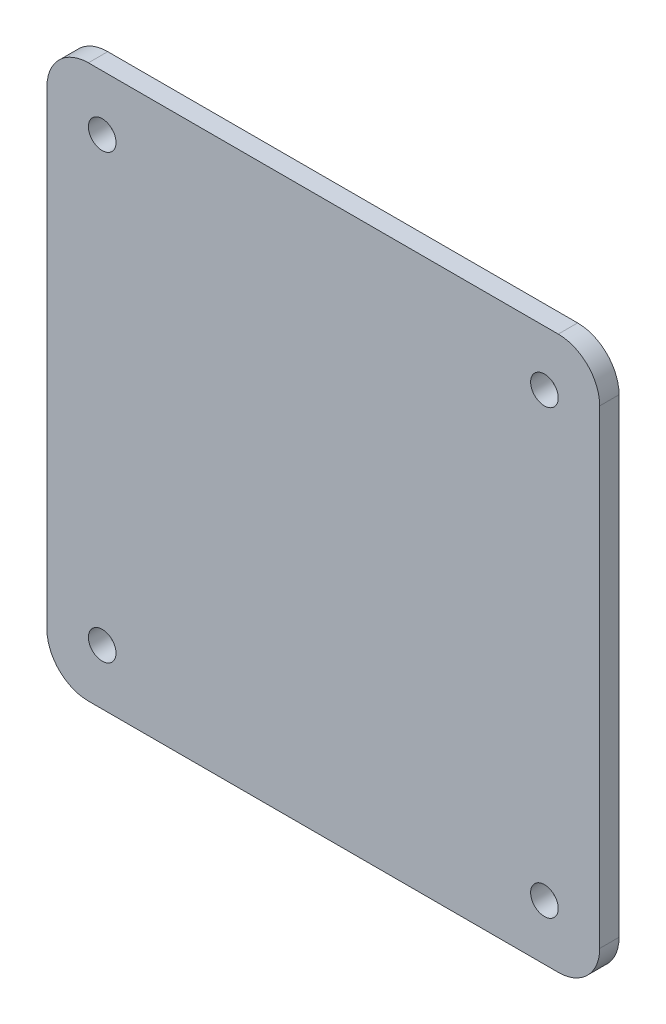
ISO-10303-21;
HEADER;
FILE_DESCRIPTION(('STEP AP214'),'2;1');
FILE_NAME('part.step','',(''),(''),'','','');
FILE_SCHEMA(('AUTOMOTIVE_DESIGN { 1 0 10303 214 1 1 1 1 }'));
ENDSEC;
DATA;
#1=APPLICATION_CONTEXT('core data for automotive mechanical design processes');
#2=APPLICATION_PROTOCOL_DEFINITION('international standard','automotive_design',2000,#1);
#3=PRODUCT_CONTEXT('',#1,'mechanical');
#4=PRODUCT('Part','Part','',(#3));
#5=PRODUCT_RELATED_PRODUCT_CATEGORY('part','',(#4));
#6=PRODUCT_DEFINITION_FORMATION('','',#4);
#7=PRODUCT_DEFINITION_CONTEXT('part definition',#1,'design');
#8=PRODUCT_DEFINITION('design','',#6,#7);
#9=PRODUCT_DEFINITION_SHAPE('','',#8);
#10=(LENGTH_UNIT() NAMED_UNIT(*) SI_UNIT(.MILLI.,.METRE.));
#11=(NAMED_UNIT(*) PLANE_ANGLE_UNIT() SI_UNIT($,.RADIAN.));
#12=(NAMED_UNIT(*) SI_UNIT($,.STERADIAN.) SOLID_ANGLE_UNIT());
#13=UNCERTAINTY_MEASURE_WITH_UNIT(LENGTH_MEASURE(1.E-05),#10,'distance_accuracy_value','');
#14=(GEOMETRIC_REPRESENTATION_CONTEXT(3) GLOBAL_UNCERTAINTY_ASSIGNED_CONTEXT((#13)) GLOBAL_UNIT_ASSIGNED_CONTEXT((#10,
#11,#12)) REPRESENTATION_CONTEXT('',''));
#15=CARTESIAN_POINT('',(0.,0.,0.));
#16=DIRECTION('',(0.,0.,1.));
#17=DIRECTION('',(1.,0.,0.));
#18=AXIS2_PLACEMENT_3D('',#15,#16,#17);
#19=CARTESIAN_POINT('',(0.,0.,7.));
#20=DIRECTION('',(0.,0.,-1.));
#21=DIRECTION('',(-1.,0.,0.));
#22=AXIS2_PLACEMENT_3D('',#19,#20,#21);
#23=PLANE('',#22);
#24=DIRECTION('',(0.,-1.,0.));
#25=VECTOR('',#24,1.);
#26=CARTESIAN_POINT('',(-100.,-100.,7.));
#27=LINE('',#26,#25);
#28=CARTESIAN_POINT('',(-100.,85.,7.));
#29=VERTEX_POINT('',#28);
#30=CARTESIAN_POINT('',(-100.,-85.,7.));
#31=VERTEX_POINT('',#30);
#32=EDGE_CURVE('E140',#29,#31,#27,.T.);
#33=ORIENTED_EDGE('',*,*,#32,.T.);
#34=CARTESIAN_POINT('',(-85.,-85.,7.));
#35=DIRECTION('',(0.,0.,-1.));
#36=DIRECTION('',(-1.,0.,0.));
#37=AXIS2_PLACEMENT_3D('',#34,#35,#36);
#38=CIRCLE('',#37,15.);
#39=CARTESIAN_POINT('',(-85.,-100.,7.));
#40=VERTEX_POINT('',#39);
#41=EDGE_CURVE('E155',#31,#40,#38,.F.);
#42=ORIENTED_EDGE('',*,*,#41,.T.);
#43=DIRECTION('',(1.,0.,0.));
#44=VECTOR('',#43,1.);
#45=CARTESIAN_POINT('',(-100.,-100.,7.));
#46=LINE('',#45,#44);
#47=CARTESIAN_POINT('',(85.,-100.,7.));
#48=VERTEX_POINT('',#47);
#49=EDGE_CURVE('E122',#40,#48,#46,.T.);
#50=ORIENTED_EDGE('',*,*,#49,.T.);
#51=CARTESIAN_POINT('',(85.,-85.,7.));
#52=DIRECTION('',(0.,0.,-1.));
#53=DIRECTION('',(-1.,0.,0.));
#54=AXIS2_PLACEMENT_3D('',#51,#52,#53);
#55=CIRCLE('',#54,15.);
#56=CARTESIAN_POINT('',(100.,-85.,7.));
#57=VERTEX_POINT('',#56);
#58=EDGE_CURVE('E150',#48,#57,#55,.F.);
#59=ORIENTED_EDGE('',*,*,#58,.T.);
#60=DIRECTION('',(0.,1.,0.));
#61=VECTOR('',#60,1.);
#62=CARTESIAN_POINT('',(100.,-100.,7.));
#63=LINE('',#62,#61);
#64=CARTESIAN_POINT('',(100.,85.,7.));
#65=VERTEX_POINT('',#64);
#66=EDGE_CURVE('E166',#57,#65,#63,.T.);
#67=ORIENTED_EDGE('',*,*,#66,.T.);
#68=CARTESIAN_POINT('',(85.,85.,7.));
#69=DIRECTION('',(0.,0.,-1.));
#70=DIRECTION('',(-1.,0.,0.));
#71=AXIS2_PLACEMENT_3D('',#68,#69,#70);
#72=CIRCLE('',#71,15.);
#73=CARTESIAN_POINT('',(85.,100.,7.));
#74=VERTEX_POINT('',#73);
#75=EDGE_CURVE('E58',#65,#74,#72,.F.);
#76=ORIENTED_EDGE('',*,*,#75,.T.);
#77=DIRECTION('',(-1.,0.,0.));
#78=VECTOR('',#77,1.);
#79=CARTESIAN_POINT('',(-100.,100.,7.));
#80=LINE('',#79,#78);
#81=CARTESIAN_POINT('',(-85.,100.,7.));
#82=VERTEX_POINT('',#81);
#83=EDGE_CURVE('E141',#74,#82,#80,.T.);
#84=ORIENTED_EDGE('',*,*,#83,.T.);
#85=CARTESIAN_POINT('',(-85.,85.,7.));
#86=DIRECTION('',(0.,0.,-1.));
#87=DIRECTION('',(-1.,0.,0.));
#88=AXIS2_PLACEMENT_3D('',#85,#86,#87);
#89=CIRCLE('',#88,15.);
#90=EDGE_CURVE('E153',#82,#29,#89,.F.);
#91=ORIENTED_EDGE('',*,*,#90,.T.);
#92=EDGE_LOOP('',(#33,#42,#50,#59,#67,#76,#84,#91));
#93=FACE_BOUND('',#92,.T.);
#94=CARTESIAN_POINT('',(80.,80.,7.));
#95=DIRECTION('',(0.,0.,1.));
#96=DIRECTION('',(1.,0.,0.));
#97=AXIS2_PLACEMENT_3D('',#94,#95,#96);
#98=CIRCLE('',#97,5.00000000000001);
#99=CARTESIAN_POINT('',(85.,80.,7.));
#100=VERTEX_POINT('',#99);
#101=EDGE_CURVE('E135',#100,#100,#98,.T.);
#102=ORIENTED_EDGE('',*,*,#101,.F.);
#103=EDGE_LOOP('',(#102));
#104=FACE_BOUND('',#103,.T.);
#105=CARTESIAN_POINT('',(80.,-80.,7.));
#106=DIRECTION('',(0.,0.,1.));
#107=DIRECTION('',(1.,0.,0.));
#108=AXIS2_PLACEMENT_3D('',#105,#106,#107);
#109=CIRCLE('',#108,5.00000000000001);
#110=CARTESIAN_POINT('',(85.,-80.,7.));
#111=VERTEX_POINT('',#110);
#112=EDGE_CURVE('E183',#111,#111,#109,.T.);
#113=ORIENTED_EDGE('',*,*,#112,.F.);
#114=EDGE_LOOP('',(#113));
#115=FACE_BOUND('',#114,.T.);
#116=CARTESIAN_POINT('',(-80.,-80.,7.));
#117=DIRECTION('',(0.,0.,1.));
#118=DIRECTION('',(1.,0.,0.));
#119=AXIS2_PLACEMENT_3D('',#116,#117,#118);
#120=CIRCLE('',#119,5.00000000000001);
#121=CARTESIAN_POINT('',(-75.,-80.,7.));
#122=VERTEX_POINT('',#121);
#123=EDGE_CURVE('E189',#122,#122,#120,.T.);
#124=ORIENTED_EDGE('',*,*,#123,.F.);
#125=EDGE_LOOP('',(#124));
#126=FACE_BOUND('',#125,.T.);
#127=CARTESIAN_POINT('',(-80.,80.,7.));
#128=DIRECTION('',(0.,0.,1.));
#129=DIRECTION('',(1.,0.,0.));
#130=AXIS2_PLACEMENT_3D('',#127,#128,#129);
#131=CIRCLE('',#130,5.00000000000001);
#132=CARTESIAN_POINT('',(-75.,80.,7.));
#133=VERTEX_POINT('',#132);
#134=EDGE_CURVE('E195',#133,#133,#131,.T.);
#135=ORIENTED_EDGE('',*,*,#134,.F.);
#136=EDGE_LOOP('',(#135));
#137=FACE_BOUND('',#136,.T.);
#138=ADVANCED_FACE('F36',(#93,#104,#115,#126,#137),#23,.F.);
#139=CARTESIAN_POINT('',(0.,0.,0.));
#140=DIRECTION('',(0.,0.,-1.));
#141=DIRECTION('',(-1.,0.,0.));
#142=AXIS2_PLACEMENT_3D('',#139,#140,#141);
#143=PLANE('',#142);
#144=CARTESIAN_POINT('',(-80.,-80.,0.));
#145=DIRECTION('',(0.,0.,1.));
#146=DIRECTION('',(1.,0.,0.));
#147=AXIS2_PLACEMENT_3D('',#144,#145,#146);
#148=CIRCLE('',#147,5.00000000000001);
#149=CARTESIAN_POINT('',(-75.,-80.,0.));
#150=VERTEX_POINT('',#149);
#151=EDGE_CURVE('E192',#150,#150,#148,.T.);
#152=ORIENTED_EDGE('',*,*,#151,.T.);
#153=EDGE_LOOP('',(#152));
#154=FACE_BOUND('',#153,.T.);
#155=CARTESIAN_POINT('',(80.,80.,0.));
#156=DIRECTION('',(0.,0.,1.));
#157=DIRECTION('',(1.,0.,0.));
#158=AXIS2_PLACEMENT_3D('',#155,#156,#157);
#159=CIRCLE('',#158,5.00000000000001);
#160=CARTESIAN_POINT('',(85.,80.,0.));
#161=VERTEX_POINT('',#160);
#162=EDGE_CURVE('E180',#161,#161,#159,.T.);
#163=ORIENTED_EDGE('',*,*,#162,.T.);
#164=EDGE_LOOP('',(#163));
#165=FACE_BOUND('',#164,.T.);
#166=DIRECTION('',(1.,0.,0.));
#167=VECTOR('',#166,1.);
#168=CARTESIAN_POINT('',(-100.,-100.,0.));
#169=LINE('',#168,#167);
#170=CARTESIAN_POINT('',(-85.,-100.,0.));
#171=VERTEX_POINT('',#170);
#172=CARTESIAN_POINT('',(85.,-100.,0.));
#173=VERTEX_POINT('',#172);
#174=EDGE_CURVE('E119',#171,#173,#169,.T.);
#175=ORIENTED_EDGE('',*,*,#174,.F.);
#176=CARTESIAN_POINT('',(-85.,-85.,0.));
#177=DIRECTION('',(0.,0.,-1.));
#178=DIRECTION('',(-1.,0.,0.));
#179=AXIS2_PLACEMENT_3D('',#176,#177,#178);
#180=CIRCLE('',#179,15.);
#181=CARTESIAN_POINT('',(-100.,-85.,0.));
#182=VERTEX_POINT('',#181);
#183=EDGE_CURVE('E102',#171,#182,#180,.T.);
#184=ORIENTED_EDGE('',*,*,#183,.T.);
#185=DIRECTION('',(0.,-1.,0.));
#186=VECTOR('',#185,1.);
#187=CARTESIAN_POINT('',(-100.,-100.,0.));
#188=LINE('',#187,#186);
#189=CARTESIAN_POINT('',(-100.,85.,0.));
#190=VERTEX_POINT('',#189);
#191=EDGE_CURVE('E130',#190,#182,#188,.T.);
#192=ORIENTED_EDGE('',*,*,#191,.F.);
#193=CARTESIAN_POINT('',(-85.,85.,0.));
#194=DIRECTION('',(0.,0.,-1.));
#195=DIRECTION('',(-1.,0.,0.));
#196=AXIS2_PLACEMENT_3D('',#193,#194,#195);
#197=CIRCLE('',#196,15.);
#198=CARTESIAN_POINT('',(-85.,100.,0.));
#199=VERTEX_POINT('',#198);
#200=EDGE_CURVE('E113',#190,#199,#197,.T.);
#201=ORIENTED_EDGE('',*,*,#200,.T.);
#202=DIRECTION('',(-1.,0.,0.));
#203=VECTOR('',#202,1.);
#204=CARTESIAN_POINT('',(-100.,100.,0.));
#205=LINE('',#204,#203);
#206=CARTESIAN_POINT('',(85.,100.,0.));
#207=VERTEX_POINT('',#206);
#208=EDGE_CURVE('E133',#207,#199,#205,.T.);
#209=ORIENTED_EDGE('',*,*,#208,.F.);
#210=CARTESIAN_POINT('',(85.,85.,0.));
#211=DIRECTION('',(0.,0.,-1.));
#212=DIRECTION('',(-1.,0.,0.));
#213=AXIS2_PLACEMENT_3D('',#210,#211,#212);
#214=CIRCLE('',#213,15.);
#215=CARTESIAN_POINT('',(100.,85.,0.));
#216=VERTEX_POINT('',#215);
#217=EDGE_CURVE('E144',#207,#216,#214,.T.);
#218=ORIENTED_EDGE('',*,*,#217,.T.);
#219=DIRECTION('',(0.,1.,0.));
#220=VECTOR('',#219,1.);
#221=CARTESIAN_POINT('',(100.,-100.,0.));
#222=LINE('',#221,#220);
#223=CARTESIAN_POINT('',(100.,-85.,0.));
#224=VERTEX_POINT('',#223);
#225=EDGE_CURVE('E129',#224,#216,#222,.T.);
#226=ORIENTED_EDGE('',*,*,#225,.F.);
#227=CARTESIAN_POINT('',(85.,-85.,0.));
#228=DIRECTION('',(0.,0.,-1.));
#229=DIRECTION('',(-1.,0.,0.));
#230=AXIS2_PLACEMENT_3D('',#227,#228,#229);
#231=CIRCLE('',#230,15.);
#232=EDGE_CURVE('E123',#224,#173,#231,.T.);
#233=ORIENTED_EDGE('',*,*,#232,.T.);
#234=EDGE_LOOP('',(#175,#184,#192,#201,#209,#218,#226,#233));
#235=FACE_BOUND('',#234,.T.);
#236=CARTESIAN_POINT('',(80.,-80.,0.));
#237=DIRECTION('',(0.,0.,1.));
#238=DIRECTION('',(1.,0.,0.));
#239=AXIS2_PLACEMENT_3D('',#236,#237,#238);
#240=CIRCLE('',#239,5.00000000000001);
#241=CARTESIAN_POINT('',(85.,-80.,0.));
#242=VERTEX_POINT('',#241);
#243=EDGE_CURVE('E186',#242,#242,#240,.T.);
#244=ORIENTED_EDGE('',*,*,#243,.T.);
#245=EDGE_LOOP('',(#244));
#246=FACE_BOUND('',#245,.T.);
#247=CARTESIAN_POINT('',(-80.,80.,0.));
#248=DIRECTION('',(0.,0.,1.));
#249=DIRECTION('',(1.,0.,0.));
#250=AXIS2_PLACEMENT_3D('',#247,#248,#249);
#251=CIRCLE('',#250,5.00000000000001);
#252=CARTESIAN_POINT('',(-75.,80.,0.));
#253=VERTEX_POINT('',#252);
#254=EDGE_CURVE('E198',#253,#253,#251,.T.);
#255=ORIENTED_EDGE('',*,*,#254,.T.);
#256=EDGE_LOOP('',(#255));
#257=FACE_BOUND('',#256,.T.);
#258=ADVANCED_FACE('F126',(#154,#165,#235,#246,#257),#143,.T.);
#259=CARTESIAN_POINT('',(-100.,-100.,7.));
#260=DIRECTION('',(1.,0.,0.));
#261=DIRECTION('',(0.,0.,-1.));
#262=AXIS2_PLACEMENT_3D('',#259,#260,#261);
#263=PLANE('',#262);
#264=ORIENTED_EDGE('',*,*,#191,.T.);
#265=DIRECTION('',(0.,0.,-1.));
#266=VECTOR('',#265,1.);
#267=CARTESIAN_POINT('',(-100.,-85.,7.));
#268=LINE('',#267,#266);
#269=EDGE_CURVE('E107',#182,#31,#268,.F.);
#270=ORIENTED_EDGE('',*,*,#269,.T.);
#271=ORIENTED_EDGE('',*,*,#32,.F.);
#272=DIRECTION('',(0.,0.,-1.));
#273=VECTOR('',#272,1.);
#274=CARTESIAN_POINT('',(-100.,85.,7.));
#275=LINE('',#274,#273);
#276=EDGE_CURVE('E112',#29,#190,#275,.T.);
#277=ORIENTED_EDGE('',*,*,#276,.T.);
#278=EDGE_LOOP('',(#264,#270,#271,#277));
#279=FACE_BOUND('',#278,.T.);
#280=ADVANCED_FACE('F212',(#279),#263,.F.);
#281=CARTESIAN_POINT('',(-100.,-100.,7.));
#282=DIRECTION('',(0.,1.,0.));
#283=DIRECTION('',(-1.,0.,0.));
#284=AXIS2_PLACEMENT_3D('',#281,#282,#283);
#285=PLANE('',#284);
#286=ORIENTED_EDGE('',*,*,#49,.F.);
#287=DIRECTION('',(0.,0.,-1.));
#288=VECTOR('',#287,1.);
#289=CARTESIAN_POINT('',(-85.,-100.,7.));
#290=LINE('',#289,#288);
#291=EDGE_CURVE('E106',#40,#171,#290,.T.);
#292=ORIENTED_EDGE('',*,*,#291,.T.);
#293=ORIENTED_EDGE('',*,*,#174,.T.);
#294=DIRECTION('',(0.,0.,-1.));
#295=VECTOR('',#294,1.);
#296=CARTESIAN_POINT('',(85.,-100.,7.));
#297=LINE('',#296,#295);
#298=EDGE_CURVE('E124',#173,#48,#297,.F.);
#299=ORIENTED_EDGE('',*,*,#298,.T.);
#300=EDGE_LOOP('',(#286,#292,#293,#299));
#301=FACE_BOUND('',#300,.T.);
#302=ADVANCED_FACE('F118',(#301),#285,.F.);
#303=CARTESIAN_POINT('',(100.,-100.,7.));
#304=DIRECTION('',(-1.,0.,0.));
#305=DIRECTION('',(0.,0.,1.));
#306=AXIS2_PLACEMENT_3D('',#303,#304,#305);
#307=PLANE('',#306);
#308=ORIENTED_EDGE('',*,*,#225,.T.);
#309=DIRECTION('',(0.,0.,-1.));
#310=VECTOR('',#309,1.);
#311=CARTESIAN_POINT('',(100.,85.,7.));
#312=LINE('',#311,#310);
#313=EDGE_CURVE('E11',#216,#65,#312,.F.);
#314=ORIENTED_EDGE('',*,*,#313,.T.);
#315=ORIENTED_EDGE('',*,*,#66,.F.);
#316=DIRECTION('',(0.,0.,-1.));
#317=VECTOR('',#316,1.);
#318=CARTESIAN_POINT('',(100.,-85.,7.));
#319=LINE('',#318,#317);
#320=EDGE_CURVE('E44',#57,#224,#319,.T.);
#321=ORIENTED_EDGE('',*,*,#320,.T.);
#322=EDGE_LOOP('',(#308,#314,#315,#321));
#323=FACE_BOUND('',#322,.T.);
#324=ADVANCED_FACE('F164',(#323),#307,.F.);
#325=CARTESIAN_POINT('',(-100.,100.,7.));
#326=DIRECTION('',(0.,-1.,0.));
#327=DIRECTION('',(0.,0.,-1.));
#328=AXIS2_PLACEMENT_3D('',#325,#326,#327);
#329=PLANE('',#328);
#330=ORIENTED_EDGE('',*,*,#208,.T.);
#331=DIRECTION('',(0.,0.,-1.));
#332=VECTOR('',#331,1.);
#333=CARTESIAN_POINT('',(-85.,100.,7.));
#334=LINE('',#333,#332);
#335=EDGE_CURVE('E51',#199,#82,#334,.F.);
#336=ORIENTED_EDGE('',*,*,#335,.T.);
#337=ORIENTED_EDGE('',*,*,#83,.F.);
#338=DIRECTION('',(0.,0.,-1.));
#339=VECTOR('',#338,1.);
#340=CARTESIAN_POINT('',(85.,100.,7.));
#341=LINE('',#340,#339);
#342=EDGE_CURVE('E157',#74,#207,#341,.T.);
#343=ORIENTED_EDGE('',*,*,#342,.T.);
#344=EDGE_LOOP('',(#330,#336,#337,#343));
#345=FACE_BOUND('',#344,.T.);
#346=ADVANCED_FACE('F173',(#345),#329,.F.);
#347=CARTESIAN_POINT('',(80.,80.,7.));
#348=DIRECTION('',(0.,0.,-1.));
#349=DIRECTION('',(-1.,0.,0.));
#350=AXIS2_PLACEMENT_3D('',#347,#348,#349);
#351=CYLINDRICAL_SURFACE('',#350,5.00000000000001);
#352=ORIENTED_EDGE('',*,*,#101,.T.);
#353=EDGE_LOOP('',(#352));
#354=FACE_BOUND('',#353,.T.);
#355=ORIENTED_EDGE('',*,*,#162,.F.);
#356=EDGE_LOOP('',(#355));
#357=FACE_BOUND('',#356,.T.);
#358=ADVANCED_FACE('F217',(#354,#357),#351,.F.);
#359=CARTESIAN_POINT('',(80.,-80.,7.));
#360=DIRECTION('',(0.,0.,-1.));
#361=DIRECTION('',(-1.,0.,0.));
#362=AXIS2_PLACEMENT_3D('',#359,#360,#361);
#363=CYLINDRICAL_SURFACE('',#362,5.00000000000001);
#364=ORIENTED_EDGE('',*,*,#112,.T.);
#365=EDGE_LOOP('',(#364));
#366=FACE_BOUND('',#365,.T.);
#367=ORIENTED_EDGE('',*,*,#243,.F.);
#368=EDGE_LOOP('',(#367));
#369=FACE_BOUND('',#368,.T.);
#370=ADVANCED_FACE('F312',(#366,#369),#363,.F.);
#371=CARTESIAN_POINT('',(-80.,-80.,7.));
#372=DIRECTION('',(0.,0.,-1.));
#373=DIRECTION('',(-1.,0.,0.));
#374=AXIS2_PLACEMENT_3D('',#371,#372,#373);
#375=CYLINDRICAL_SURFACE('',#374,5.00000000000001);
#376=ORIENTED_EDGE('',*,*,#123,.T.);
#377=EDGE_LOOP('',(#376));
#378=FACE_BOUND('',#377,.T.);
#379=ORIENTED_EDGE('',*,*,#151,.F.);
#380=EDGE_LOOP('',(#379));
#381=FACE_BOUND('',#380,.T.);
#382=ADVANCED_FACE('F303',(#378,#381),#375,.F.);
#383=CARTESIAN_POINT('',(-80.,80.,7.));
#384=DIRECTION('',(0.,0.,-1.));
#385=DIRECTION('',(-1.,0.,0.));
#386=AXIS2_PLACEMENT_3D('',#383,#384,#385);
#387=CYLINDRICAL_SURFACE('',#386,5.00000000000001);
#388=ORIENTED_EDGE('',*,*,#134,.T.);
#389=EDGE_LOOP('',(#388));
#390=FACE_BOUND('',#389,.T.);
#391=ORIENTED_EDGE('',*,*,#254,.F.);
#392=EDGE_LOOP('',(#391));
#393=FACE_BOUND('',#392,.T.);
#394=ADVANCED_FACE('F204',(#390,#393),#387,.F.);
#395=CARTESIAN_POINT('',(-85.,-85.,7.));
#396=DIRECTION('',(0.,0.,-1.));
#397=DIRECTION('',(-1.,0.,0.));
#398=AXIS2_PLACEMENT_3D('',#395,#396,#397);
#399=CYLINDRICAL_SURFACE('',#398,15.);
#400=ORIENTED_EDGE('',*,*,#41,.F.);
#401=ORIENTED_EDGE('',*,*,#269,.F.);
#402=ORIENTED_EDGE('',*,*,#183,.F.);
#403=ORIENTED_EDGE('',*,*,#291,.F.);
#404=EDGE_LOOP('',(#400,#401,#402,#403));
#405=FACE_BOUND('',#404,.T.);
#406=ADVANCED_FACE('F105',(#405),#399,.T.);
#407=CARTESIAN_POINT('',(-85.,85.,7.));
#408=DIRECTION('',(0.,0.,-1.));
#409=DIRECTION('',(-1.,0.,0.));
#410=AXIS2_PLACEMENT_3D('',#407,#408,#409);
#411=CYLINDRICAL_SURFACE('',#410,15.);
#412=ORIENTED_EDGE('',*,*,#90,.F.);
#413=ORIENTED_EDGE('',*,*,#335,.F.);
#414=ORIENTED_EDGE('',*,*,#200,.F.);
#415=ORIENTED_EDGE('',*,*,#276,.F.);
#416=EDGE_LOOP('',(#412,#413,#414,#415));
#417=FACE_BOUND('',#416,.T.);
#418=ADVANCED_FACE('F231',(#417),#411,.T.);
#419=CARTESIAN_POINT('',(85.,85.,7.));
#420=DIRECTION('',(0.,0.,-1.));
#421=DIRECTION('',(-1.,0.,0.));
#422=AXIS2_PLACEMENT_3D('',#419,#420,#421);
#423=CYLINDRICAL_SURFACE('',#422,15.);
#424=ORIENTED_EDGE('',*,*,#75,.F.);
#425=ORIENTED_EDGE('',*,*,#313,.F.);
#426=ORIENTED_EDGE('',*,*,#217,.F.);
#427=ORIENTED_EDGE('',*,*,#342,.F.);
#428=EDGE_LOOP('',(#424,#425,#426,#427));
#429=FACE_BOUND('',#428,.T.);
#430=ADVANCED_FACE('F172',(#429),#423,.T.);
#431=CARTESIAN_POINT('',(85.,-85.,7.));
#432=DIRECTION('',(0.,0.,-1.));
#433=DIRECTION('',(-1.,0.,0.));
#434=AXIS2_PLACEMENT_3D('',#431,#432,#433);
#435=CYLINDRICAL_SURFACE('',#434,15.);
#436=ORIENTED_EDGE('',*,*,#58,.F.);
#437=ORIENTED_EDGE('',*,*,#298,.F.);
#438=ORIENTED_EDGE('',*,*,#232,.F.);
#439=ORIENTED_EDGE('',*,*,#320,.F.);
#440=EDGE_LOOP('',(#436,#437,#438,#439));
#441=FACE_BOUND('',#440,.T.);
#442=ADVANCED_FACE('F38',(#441),#435,.T.);
#443=CLOSED_SHELL('',(#138,#258,#280,#302,#324,#346,#358,#370,#382,#394,#406,#418,#430,#442));
#444=MANIFOLD_SOLID_BREP('B2',#443);
#445=ADVANCED_BREP_SHAPE_REPRESENTATION('',(#18,#444),#14);
#446=SHAPE_DEFINITION_REPRESENTATION(#9,#445);
ENDSEC;
END-ISO-10303-21;
